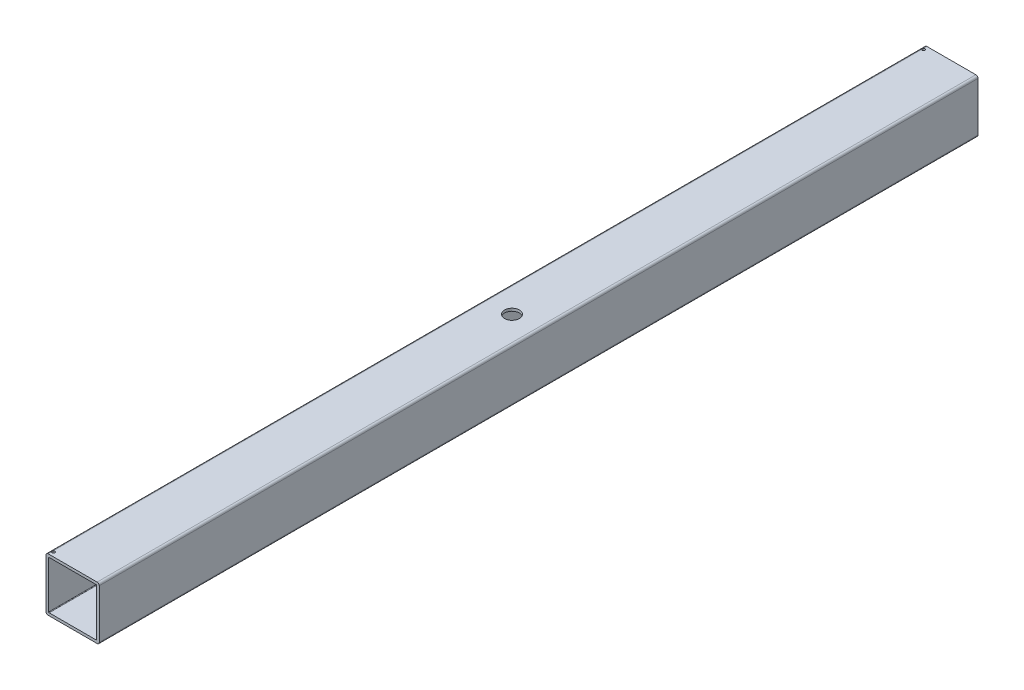
ISO-10303-21;
HEADER;
FILE_DESCRIPTION(('STEP AP214'),'2;1');
FILE_NAME('part.step','',(''),(''),'','','');
FILE_SCHEMA(('AUTOMOTIVE_DESIGN { 1 0 10303 214 1 1 1 1 }'));
ENDSEC;
DATA;
#1=APPLICATION_CONTEXT('core data for automotive mechanical design processes');
#2=APPLICATION_PROTOCOL_DEFINITION('international standard','automotive_design',2000,#1);
#3=PRODUCT_CONTEXT('',#1,'mechanical');
#4=PRODUCT('Part','Part','',(#3));
#5=PRODUCT_RELATED_PRODUCT_CATEGORY('part','',(#4));
#6=PRODUCT_DEFINITION_FORMATION('','',#4);
#7=PRODUCT_DEFINITION_CONTEXT('part definition',#1,'design');
#8=PRODUCT_DEFINITION('design','',#6,#7);
#9=PRODUCT_DEFINITION_SHAPE('','',#8);
#10=(LENGTH_UNIT() NAMED_UNIT(*) SI_UNIT(.MILLI.,.METRE.));
#11=(NAMED_UNIT(*) PLANE_ANGLE_UNIT() SI_UNIT($,.RADIAN.));
#12=(NAMED_UNIT(*) SI_UNIT($,.STERADIAN.) SOLID_ANGLE_UNIT());
#13=UNCERTAINTY_MEASURE_WITH_UNIT(LENGTH_MEASURE(1.E-05),#10,'distance_accuracy_value','');
#14=(GEOMETRIC_REPRESENTATION_CONTEXT(3) GLOBAL_UNCERTAINTY_ASSIGNED_CONTEXT((#13)) GLOBAL_UNIT_ASSIGNED_CONTEXT((#10,
#11,#12)) REPRESENTATION_CONTEXT('',''));
#15=CARTESIAN_POINT('',(0.,0.,0.));
#16=DIRECTION('',(0.,0.,1.));
#17=DIRECTION('',(1.,0.,0.));
#18=AXIS2_PLACEMENT_3D('',#15,#16,#17);
#19=CARTESIAN_POINT('',(-1271.,96.,925.));
#20=DIRECTION('',(0.,0.,-1.));
#21=DIRECTION('',(-1.,0.,0.));
#22=AXIS2_PLACEMENT_3D('',#19,#20,#21);
#23=CYLINDRICAL_SURFACE('',#22,4.);
#24=DIRECTION('',(0.,0.,1.));
#25=VECTOR('',#24,1.);
#26=CARTESIAN_POINT('',(-1271.,100.,825.));
#27=LINE('',#26,#25);
#28=CARTESIAN_POINT('',(-1271.,100.,-815.338675227417));
#29=VERTEX_POINT('',#28);
#30=CARTESIAN_POINT('',(-1271.,100.,815.338675227417));
#31=VERTEX_POINT('',#30);
#32=EDGE_CURVE('E327',#29,#31,#27,.T.);
#33=ORIENTED_EDGE('',*,*,#32,.F.);
#34=CARTESIAN_POINT('',(-1271.,100.,-815.338675227417));
#35=CARTESIAN_POINT('',(-1271.04662499454,99.9999972262744,-815.394804937775));
#36=CARTESIAN_POINT('',(-1271.09085769348,99.9991854036839,-815.452865081695));
#37=CARTESIAN_POINT('',(-1271.17427283019,99.9964200024779,-815.572464917357));
#38=CARTESIAN_POINT('',(-1271.21345628017,99.9944666531353,-815.634003908139));
#39=CARTESIAN_POINT('',(-1271.32297788215,99.9876131176814,-815.823158705195));
#40=CARTESIAN_POINT('',(-1271.38539465559,99.9817172672431,-815.955441893645));
#41=CARTESIAN_POINT('',(-1271.48719961571,99.9705515438897,-816.228566620421));
#42=CARTESIAN_POINT('',(-1271.5265839814,99.9652817749547,-816.369409574507));
#43=CARTESIAN_POINT('',(-1271.5812168886,99.9576455388125,-816.655721048284));
#44=CARTESIAN_POINT('',(-1271.59648021106,99.9552772938029,-816.801186679483));
#45=CARTESIAN_POINT('',(-1271.60242875833,99.9543761293477,-817.092297570301));
#46=CARTESIAN_POINT('',(-1271.59316930317,99.9558345773368,-817.237941686048));
#47=CARTESIAN_POINT('',(-1271.5504527553,99.9620015264689,-817.525702293928));
#48=CARTESIAN_POINT('',(-1271.51697314742,99.966713051501,-817.667815376361));
#49=CARTESIAN_POINT('',(-1271.42685399839,99.977416249734,-817.944193657739));
#50=CARTESIAN_POINT('',(-1271.37024586477,99.9834061816658,-818.078469218201));
#51=CARTESIAN_POINT('',(-1271.23547968072,99.9936294042363,-818.335509362876));
#52=CARTESIAN_POINT('',(-1271.15737691937,99.9978671328866,-818.458302411435));
#53=CARTESIAN_POINT('',(-1271.04709950854,99.9997859361939,-818.603370212158));
#54=CARTESIAN_POINT('',(-1271.02385724197,99.9999989472665,-818.632611878701));
#55=CARTESIAN_POINT('',(-1271.,100.,-818.661324772584));
#56=B_SPLINE_CURVE_WITH_KNOTS('',3,(#34,#35,#36,#37,#38,#39,#40,#41,#42,#43,#44,#45,#46,#47,#48,
#49,#50,#51,#52,#53,#54,#55),.UNSPECIFIED.,.F.,.F.,(4,2,2,2,2,2,2,2,2,2,4),(0.,0.2187556117166,
0.437467302000045,0.874392348785056,1.31138985930284,1.74811948150028,2.18386474099981,
2.62001559260322,3.05557612851083,3.49002660937734,3.60204982101434),.UNSPECIFIED.);
#57=CARTESIAN_POINT('',(-1271.,100.,-818.661324772584));
#58=VERTEX_POINT('',#57);
#59=EDGE_CURVE('E360',#29,#58,#56,.T.);
#60=ORIENTED_EDGE('',*,*,#59,.T.);
#61=CARTESIAN_POINT('',(-1271.,100.,-825.));
#62=VERTEX_POINT('',#61);
#63=EDGE_CURVE('E324',#62,#58,#27,.T.);
#64=ORIENTED_EDGE('',*,*,#63,.F.);
#65=CARTESIAN_POINT('',(-1271.,96.,-825.));
#66=DIRECTION('',(0.,0.,1.));
#67=DIRECTION('',(1.,0.,0.));
#68=AXIS2_PLACEMENT_3D('',#65,#66,#67);
#69=CIRCLE('',#68,4.);
#70=CARTESIAN_POINT('',(-1275.,96.,-825.));
#71=VERTEX_POINT('',#70);
#72=EDGE_CURVE('E342',#71,#62,#69,.F.);
#73=ORIENTED_EDGE('',*,*,#72,.F.);
#74=DIRECTION('',(0.,0.,1.));
#75=VECTOR('',#74,1.);
#76=CARTESIAN_POINT('',(-1275.,96.,-825.));
#77=LINE('',#76,#75);
#78=CARTESIAN_POINT('',(-1275.,96.,825.));
#79=VERTEX_POINT('',#78);
#80=EDGE_CURVE('E312',#79,#71,#77,.F.);
#81=ORIENTED_EDGE('',*,*,#80,.F.);
#82=CARTESIAN_POINT('',(-1271.,96.,825.));
#83=DIRECTION('',(0.,0.,-1.));
#84=DIRECTION('',(-1.,0.,0.));
#85=AXIS2_PLACEMENT_3D('',#82,#83,#84);
#86=CIRCLE('',#85,4.);
#87=CARTESIAN_POINT('',(-1271.,100.,825.));
#88=VERTEX_POINT('',#87);
#89=EDGE_CURVE('E321',#88,#79,#86,.F.);
#90=ORIENTED_EDGE('',*,*,#89,.F.);
#91=CARTESIAN_POINT('',(-1271.,100.,818.661324772584));
#92=VERTEX_POINT('',#91);
#93=EDGE_CURVE('E328',#92,#88,#27,.T.);
#94=ORIENTED_EDGE('',*,*,#93,.F.);
#95=CARTESIAN_POINT('',(-1271.,100.,818.661324772584));
#96=CARTESIAN_POINT('',(-1271.04662499454,99.9999972262744,818.605195062226));
#97=CARTESIAN_POINT('',(-1271.09085769348,99.9991854036839,818.547134918306));
#98=CARTESIAN_POINT('',(-1271.17427283019,99.9964200024779,818.427535082644));
#99=CARTESIAN_POINT('',(-1271.21345628017,99.9944666531353,818.365996091862));
#100=CARTESIAN_POINT('',(-1271.32297788215,99.9876131176814,818.176841294805));
#101=CARTESIAN_POINT('',(-1271.38539465559,99.9817172672431,818.044558106356));
#102=CARTESIAN_POINT('',(-1271.48719961571,99.9705515438897,817.771433379579));
#103=CARTESIAN_POINT('',(-1271.5265839814,99.9652817749547,817.630590425494));
#104=CARTESIAN_POINT('',(-1271.5812168886,99.9576455388125,817.344278951716));
#105=CARTESIAN_POINT('',(-1271.59648021106,99.9552772938029,817.198813320518));
#106=CARTESIAN_POINT('',(-1271.60242875833,99.9543761293477,816.907702429699));
#107=CARTESIAN_POINT('',(-1271.59316930317,99.9558345773368,816.762058313953));
#108=CARTESIAN_POINT('',(-1271.5504527553,99.9620015264689,816.474297706073));
#109=CARTESIAN_POINT('',(-1271.51697314742,99.966713051501,816.332184623639));
#110=CARTESIAN_POINT('',(-1271.42685399839,99.977416249734,816.055806342261));
#111=CARTESIAN_POINT('',(-1271.37024586477,99.9834061816658,815.9215307818));
#112=CARTESIAN_POINT('',(-1271.23547968072,99.9936294042363,815.664490637124));
#113=CARTESIAN_POINT('',(-1271.15737691937,99.9978671328866,815.541697588566));
#114=CARTESIAN_POINT('',(-1271.04709950854,99.9997859361939,815.396629787842));
#115=CARTESIAN_POINT('',(-1271.02385724197,99.9999989472665,815.3673881213));
#116=CARTESIAN_POINT('',(-1271.,100.,815.338675227417));
#117=B_SPLINE_CURVE_WITH_KNOTS('',3,(#95,#96,#97,#98,#99,#100,#101,#102,#103,#104,#105,#106,
#107,#108,#109,#110,#111,#112,#113,#114,#115,#116),.UNSPECIFIED.,.F.,.F.,(4,2,2,2,2,2,2,2,2,2,
4),(0.,0.2187556117166,0.437467302000045,0.874392348785056,1.31138985930317,1.74811948150027,
2.1838647409998,2.62001559260321,3.05557612851082,3.49002660937733,3.60204982101433),.UNSPECIFIED.);
#118=EDGE_CURVE('E361',#92,#31,#117,.T.);
#119=ORIENTED_EDGE('',*,*,#118,.T.);
#120=EDGE_LOOP('',(#33,#60,#64,#73,#81,#90,#94,#119));
#121=FACE_BOUND('',#120,.T.);
#122=ADVANCED_FACE('F19',(#121),#23,.T.);
#123=CARTESIAN_POINT('',(-1175.,100.,825.));
#124=DIRECTION('',(1.,0.,0.));
#125=DIRECTION('',(0.,0.,-1.));
#126=AXIS2_PLACEMENT_3D('',#123,#124,#125);
#127=PLANE('',#126);
#128=DIRECTION('',(0.,1.,0.));
#129=VECTOR('',#128,1.);
#130=CARTESIAN_POINT('',(-1175.,100.,825.));
#131=LINE('',#130,#129);
#132=CARTESIAN_POINT('',(-1175.,4.,825.));
#133=VERTEX_POINT('',#132);
#134=CARTESIAN_POINT('',(-1175.,96.,825.));
#135=VERTEX_POINT('',#134);
#136=EDGE_CURVE('E264',#133,#135,#131,.T.);
#137=ORIENTED_EDGE('',*,*,#136,.F.);
#138=DIRECTION('',(0.,0.,1.));
#139=VECTOR('',#138,1.);
#140=CARTESIAN_POINT('',(-1175.,4.,825.));
#141=LINE('',#140,#139);
#142=CARTESIAN_POINT('',(-1175.,4.,-825.));
#143=VERTEX_POINT('',#142);
#144=EDGE_CURVE('E340',#133,#143,#141,.F.);
#145=ORIENTED_EDGE('',*,*,#144,.T.);
#146=DIRECTION('',(0.,1.,0.));
#147=VECTOR('',#146,1.);
#148=CARTESIAN_POINT('',(-1175.,100.,-825.));
#149=LINE('',#148,#147);
#150=CARTESIAN_POINT('',(-1175.,96.,-825.));
#151=VERTEX_POINT('',#150);
#152=EDGE_CURVE('E260',#151,#143,#149,.F.);
#153=ORIENTED_EDGE('',*,*,#152,.F.);
#154=DIRECTION('',(0.,0.,1.));
#155=VECTOR('',#154,1.);
#156=CARTESIAN_POINT('',(-1175.,96.,825.));
#157=LINE('',#156,#155);
#158=EDGE_CURVE('E337',#151,#135,#157,.T.);
#159=ORIENTED_EDGE('',*,*,#158,.T.);
#160=EDGE_LOOP('',(#137,#145,#153,#159));
#161=FACE_BOUND('',#160,.T.);
#162=ADVANCED_FACE('F403',(#161),#127,.T.);
#163=CARTESIAN_POINT('',(358.3,100.,925.));
#164=DIRECTION('',(0.,1.,0.));
#165=DIRECTION('',(0.,0.,1.));
#166=AXIS2_PLACEMENT_3D('',#163,#164,#165);
#167=PLANE('',#166);
#168=CARTESIAN_POINT('',(-1225.,100.,1.500192328956E-13));
#169=DIRECTION('',(0.,1.,0.));
#170=DIRECTION('',(0.,0.,1.));
#171=AXIS2_PLACEMENT_3D('',#168,#169,#170);
#172=CIRCLE('',#171,14.0000000000001);
#173=CARTESIAN_POINT('',(-1225.,100.,14.0000000000002));
#174=VERTEX_POINT('',#173);
#175=EDGE_CURVE('E235',#174,#174,#172,.T.);
#176=ORIENTED_EDGE('',*,*,#175,.F.);
#177=EDGE_LOOP('',(#176));
#178=FACE_BOUND('',#177,.T.);
#179=ORIENTED_EDGE('',*,*,#63,.T.);
#180=CARTESIAN_POINT('',(-1269.,100.,-817.));
#181=DIRECTION('',(0.,1.,0.));
#182=DIRECTION('',(0.,0.,1.));
#183=AXIS2_PLACEMENT_3D('',#180,#181,#182);
#184=CIRCLE('',#183,2.59999999999994);
#185=EDGE_CURVE('E42',#58,#29,#184,.F.);
#186=ORIENTED_EDGE('',*,*,#185,.T.);
#187=ORIENTED_EDGE('',*,*,#32,.T.);
#188=CARTESIAN_POINT('',(-1269.,100.,817.));
#189=DIRECTION('',(0.,1.,0.));
#190=DIRECTION('',(0.,0.,1.));
#191=AXIS2_PLACEMENT_3D('',#188,#189,#190);
#192=CIRCLE('',#191,2.59999999999994);
#193=EDGE_CURVE('E35',#31,#92,#192,.F.);
#194=ORIENTED_EDGE('',*,*,#193,.T.);
#195=ORIENTED_EDGE('',*,*,#93,.T.);
#196=DIRECTION('',(1.,0.,0.));
#197=VECTOR('',#196,1.);
#198=CARTESIAN_POINT('',(0.,100.,825.));
#199=LINE('',#198,#197);
#200=CARTESIAN_POINT('',(-1179.,100.,825.));
#201=VERTEX_POINT('',#200);
#202=EDGE_CURVE('E268',#201,#88,#199,.F.);
#203=ORIENTED_EDGE('',*,*,#202,.F.);
#204=DIRECTION('',(0.,0.,1.));
#205=VECTOR('',#204,1.);
#206=CARTESIAN_POINT('',(-1179.,100.,925.));
#207=LINE('',#206,#205);
#208=CARTESIAN_POINT('',(-1179.,100.,-825.));
#209=VERTEX_POINT('',#208);
#210=EDGE_CURVE('E323',#201,#209,#207,.F.);
#211=ORIENTED_EDGE('',*,*,#210,.T.);
#212=DIRECTION('',(-1.,0.,0.));
#213=VECTOR('',#212,1.);
#214=CARTESIAN_POINT('',(-1175.,100.,-825.));
#215=LINE('',#214,#213);
#216=EDGE_CURVE('E255',#209,#62,#215,.T.);
#217=ORIENTED_EDGE('',*,*,#216,.T.);
#218=EDGE_LOOP('',(#179,#186,#187,#194,#195,#203,#211,#217));
#219=FACE_BOUND('',#218,.T.);
#220=ADVANCED_FACE('F358',(#178,#219),#167,.T.);
#221=CARTESIAN_POINT('',(-1275.,100.,825.));
#222=DIRECTION('',(0.,0.,-1.));
#223=DIRECTION('',(-1.,0.,0.));
#224=AXIS2_PLACEMENT_3D('',#221,#222,#223);
#225=PLANE('',#224);
#226=DIRECTION('',(0.,1.,0.));
#227=VECTOR('',#226,1.);
#228=CARTESIAN_POINT('',(-1270.,100.,825.));
#229=LINE('',#228,#227);
#230=CARTESIAN_POINT('',(-1270.,5.99999999999977,825.));
#231=VERTEX_POINT('',#230);
#232=CARTESIAN_POINT('',(-1270.,93.9999999999998,825.));
#233=VERTEX_POINT('',#232);
#234=EDGE_CURVE('E241',#231,#233,#229,.T.);
#235=ORIENTED_EDGE('',*,*,#234,.T.);
#236=CARTESIAN_POINT('',(-1269.,93.9999999999998,825.));
#237=DIRECTION('',(0.,0.,-1.));
#238=DIRECTION('',(-1.,0.,0.));
#239=AXIS2_PLACEMENT_3D('',#236,#237,#238);
#240=CIRCLE('',#239,1.);
#241=CARTESIAN_POINT('',(-1269.,94.9999999999998,825.));
#242=VERTEX_POINT('',#241);
#243=EDGE_CURVE('E12',#233,#242,#240,.T.);
#244=ORIENTED_EDGE('',*,*,#243,.T.);
#245=DIRECTION('',(1.,0.,0.));
#246=VECTOR('',#245,1.);
#247=CARTESIAN_POINT('',(-1275.,94.9999999999998,825.));
#248=LINE('',#247,#246);
#249=CARTESIAN_POINT('',(-1181.,94.9999999999998,825.));
#250=VERTEX_POINT('',#249);
#251=EDGE_CURVE('E245',#242,#250,#248,.T.);
#252=ORIENTED_EDGE('',*,*,#251,.T.);
#253=CARTESIAN_POINT('',(-1181.,93.9999999999998,825.));
#254=DIRECTION('',(0.,0.,-1.));
#255=DIRECTION('',(-1.,0.,0.));
#256=AXIS2_PLACEMENT_3D('',#253,#254,#255);
#257=CIRCLE('',#256,1.);
#258=CARTESIAN_POINT('',(-1180.,93.9999999999998,825.));
#259=VERTEX_POINT('',#258);
#260=EDGE_CURVE('E608',#250,#259,#257,.T.);
#261=ORIENTED_EDGE('',*,*,#260,.T.);
#262=DIRECTION('',(0.,-1.,0.));
#263=VECTOR('',#262,1.);
#264=CARTESIAN_POINT('',(-1180.,100.,825.));
#265=LINE('',#264,#263);
#266=CARTESIAN_POINT('',(-1180.,5.99999999999977,825.));
#267=VERTEX_POINT('',#266);
#268=EDGE_CURVE('E248',#259,#267,#265,.T.);
#269=ORIENTED_EDGE('',*,*,#268,.T.);
#270=CARTESIAN_POINT('',(-1181.,5.99999999999977,825.));
#271=DIRECTION('',(0.,0.,-1.));
#272=DIRECTION('',(-1.,0.,0.));
#273=AXIS2_PLACEMENT_3D('',#270,#271,#272);
#274=CIRCLE('',#273,1.);
#275=CARTESIAN_POINT('',(-1181.,4.99999999999977,825.));
#276=VERTEX_POINT('',#275);
#277=EDGE_CURVE('E606',#267,#276,#274,.T.);
#278=ORIENTED_EDGE('',*,*,#277,.T.);
#279=DIRECTION('',(-1.,0.,0.));
#280=VECTOR('',#279,1.);
#281=CARTESIAN_POINT('',(-1275.,4.99999999999977,825.));
#282=LINE('',#281,#280);
#283=CARTESIAN_POINT('',(-1269.,4.99999999999977,825.));
#284=VERTEX_POINT('',#283);
#285=EDGE_CURVE('E239',#276,#284,#282,.T.);
#286=ORIENTED_EDGE('',*,*,#285,.T.);
#287=CARTESIAN_POINT('',(-1269.,5.99999999999977,825.));
#288=DIRECTION('',(0.,0.,-1.));
#289=DIRECTION('',(-1.,0.,0.));
#290=AXIS2_PLACEMENT_3D('',#287,#288,#289);
#291=CIRCLE('',#290,1.);
#292=EDGE_CURVE('E300',#284,#231,#291,.T.);
#293=ORIENTED_EDGE('',*,*,#292,.T.);
#294=EDGE_LOOP('',(#235,#244,#252,#261,#269,#278,#286,#293));
#295=FACE_BOUND('',#294,.T.);
#296=DIRECTION('',(1.,0.,0.));
#297=VECTOR('',#296,1.);
#298=CARTESIAN_POINT('',(0.,0.,825.));
#299=LINE('',#298,#297);
#300=CARTESIAN_POINT('',(-1271.,0.,825.));
#301=VERTEX_POINT('',#300);
#302=CARTESIAN_POINT('',(-1179.,0.,825.));
#303=VERTEX_POINT('',#302);
#304=EDGE_CURVE('E251',#301,#303,#299,.T.);
#305=ORIENTED_EDGE('',*,*,#304,.T.);
#306=CARTESIAN_POINT('',(-1179.,4.,825.));
#307=DIRECTION('',(0.,0.,-1.));
#308=DIRECTION('',(-1.,0.,0.));
#309=AXIS2_PLACEMENT_3D('',#306,#307,#308);
#310=CIRCLE('',#309,4.);
#311=EDGE_CURVE('E314',#303,#133,#310,.F.);
#312=ORIENTED_EDGE('',*,*,#311,.T.);
#313=ORIENTED_EDGE('',*,*,#136,.T.);
#314=CARTESIAN_POINT('',(-1179.,96.,825.));
#315=DIRECTION('',(0.,0.,-1.));
#316=DIRECTION('',(-1.,0.,0.));
#317=AXIS2_PLACEMENT_3D('',#314,#315,#316);
#318=CIRCLE('',#317,4.);
#319=EDGE_CURVE('E319',#135,#201,#318,.F.);
#320=ORIENTED_EDGE('',*,*,#319,.T.);
#321=ORIENTED_EDGE('',*,*,#202,.T.);
#322=ORIENTED_EDGE('',*,*,#89,.T.);
#323=DIRECTION('',(0.,1.,0.));
#324=VECTOR('',#323,1.);
#325=CARTESIAN_POINT('',(-1275.,500.,825.));
#326=LINE('',#325,#324);
#327=CARTESIAN_POINT('',(-1275.,4.,825.));
#328=VERTEX_POINT('',#327);
#329=EDGE_CURVE('E252',#328,#79,#326,.T.);
#330=ORIENTED_EDGE('',*,*,#329,.F.);
#331=CARTESIAN_POINT('',(-1271.,4.,825.));
#332=DIRECTION('',(0.,0.,-1.));
#333=DIRECTION('',(-1.,0.,0.));
#334=AXIS2_PLACEMENT_3D('',#331,#332,#333);
#335=CIRCLE('',#334,4.);
#336=EDGE_CURVE('E317',#328,#301,#335,.F.);
#337=ORIENTED_EDGE('',*,*,#336,.T.);
#338=EDGE_LOOP('',(#305,#312,#313,#320,#321,#322,#330,#337));
#339=FACE_BOUND('',#338,.T.);
#340=ADVANCED_FACE('F407',(#295,#339),#225,.F.);
#341=CARTESIAN_POINT('',(0.,0.,0.));
#342=DIRECTION('',(0.,-1.,0.));
#343=DIRECTION('',(0.,0.,-1.));
#344=AXIS2_PLACEMENT_3D('',#341,#342,#343);
#345=PLANE('',#344);
#346=CARTESIAN_POINT('',(-1225.,0.,1.500192328956E-13));
#347=DIRECTION('',(0.,-1.,0.));
#348=DIRECTION('',(0.,0.,-1.));
#349=AXIS2_PLACEMENT_3D('',#346,#347,#348);
#350=CIRCLE('',#349,14.0000000000001);
#351=CARTESIAN_POINT('',(-1225.,0.,-13.9999999999999));
#352=VERTEX_POINT('',#351);
#353=EDGE_CURVE('E227',#352,#352,#350,.T.);
#354=ORIENTED_EDGE('',*,*,#353,.F.);
#355=EDGE_LOOP('',(#354));
#356=FACE_BOUND('',#355,.T.);
#357=DIRECTION('',(-1.,0.,0.));
#358=VECTOR('',#357,1.);
#359=CARTESIAN_POINT('',(0.,0.,-825.));
#360=LINE('',#359,#358);
#361=CARTESIAN_POINT('',(-1179.,0.,-825.));
#362=VERTEX_POINT('',#361);
#363=CARTESIAN_POINT('',(-1271.,0.,-825.));
#364=VERTEX_POINT('',#363);
#365=EDGE_CURVE('E261',#362,#364,#360,.T.);
#366=ORIENTED_EDGE('',*,*,#365,.F.);
#367=DIRECTION('',(0.,0.,1.));
#368=VECTOR('',#367,1.);
#369=CARTESIAN_POINT('',(-1179.,0.,0.));
#370=LINE('',#369,#368);
#371=EDGE_CURVE('E335',#362,#303,#370,.T.);
#372=ORIENTED_EDGE('',*,*,#371,.T.);
#373=ORIENTED_EDGE('',*,*,#304,.F.);
#374=DIRECTION('',(0.,0.,-1.));
#375=VECTOR('',#374,1.);
#376=CARTESIAN_POINT('',(-1271.,0.,-825.));
#377=LINE('',#376,#375);
#378=EDGE_CURVE('E215',#301,#364,#377,.T.);
#379=ORIENTED_EDGE('',*,*,#378,.T.);
#380=EDGE_LOOP('',(#366,#372,#373,#379));
#381=FACE_BOUND('',#380,.T.);
#382=ADVANCED_FACE('F413',(#356,#381),#345,.T.);
#383=CARTESIAN_POINT('',(-1175.,100.,-825.));
#384=DIRECTION('',(0.,0.,1.));
#385=DIRECTION('',(1.,0.,0.));
#386=AXIS2_PLACEMENT_3D('',#383,#384,#385);
#387=PLANE('',#386);
#388=DIRECTION('',(0.,-1.,0.));
#389=VECTOR('',#388,1.);
#390=CARTESIAN_POINT('',(-1270.,100.,-825.));
#391=LINE('',#390,#389);
#392=CARTESIAN_POINT('',(-1270.,94.,-825.));
#393=VERTEX_POINT('',#392);
#394=CARTESIAN_POINT('',(-1270.,6.00000000000001,-825.));
#395=VERTEX_POINT('',#394);
#396=EDGE_CURVE('E201',#393,#395,#391,.T.);
#397=ORIENTED_EDGE('',*,*,#396,.T.);
#398=CARTESIAN_POINT('',(-1269.,6.,-825.));
#399=DIRECTION('',(0.,0.,1.));
#400=DIRECTION('',(1.,0.,0.));
#401=AXIS2_PLACEMENT_3D('',#398,#399,#400);
#402=CIRCLE('',#401,1.);
#403=CARTESIAN_POINT('',(-1269.,4.99999999999999,-825.));
#404=VERTEX_POINT('',#403);
#405=EDGE_CURVE('E286',#395,#404,#402,.T.);
#406=ORIENTED_EDGE('',*,*,#405,.T.);
#407=DIRECTION('',(1.,0.,0.));
#408=VECTOR('',#407,1.);
#409=CARTESIAN_POINT('',(-1175.,4.99999999999999,-825.));
#410=LINE('',#409,#408);
#411=CARTESIAN_POINT('',(-1181.,4.99999999999999,-825.));
#412=VERTEX_POINT('',#411);
#413=EDGE_CURVE('E207',#404,#412,#410,.T.);
#414=ORIENTED_EDGE('',*,*,#413,.T.);
#415=CARTESIAN_POINT('',(-1181.,6.,-825.));
#416=DIRECTION('',(0.,0.,1.));
#417=DIRECTION('',(1.,0.,0.));
#418=AXIS2_PLACEMENT_3D('',#415,#416,#417);
#419=CIRCLE('',#418,1.);
#420=CARTESIAN_POINT('',(-1180.,6.00000000000001,-825.));
#421=VERTEX_POINT('',#420);
#422=EDGE_CURVE('E284',#412,#421,#419,.T.);
#423=ORIENTED_EDGE('',*,*,#422,.T.);
#424=DIRECTION('',(0.,1.,0.));
#425=VECTOR('',#424,1.);
#426=CARTESIAN_POINT('',(-1180.,100.,-825.));
#427=LINE('',#426,#425);
#428=CARTESIAN_POINT('',(-1180.,94.,-825.));
#429=VERTEX_POINT('',#428);
#430=EDGE_CURVE('E211',#421,#429,#427,.T.);
#431=ORIENTED_EDGE('',*,*,#430,.T.);
#432=CARTESIAN_POINT('',(-1181.,94.,-825.));
#433=DIRECTION('',(0.,0.,1.));
#434=DIRECTION('',(1.,0.,0.));
#435=AXIS2_PLACEMENT_3D('',#432,#433,#434);
#436=CIRCLE('',#435,1.);
#437=CARTESIAN_POINT('',(-1181.,95.,-825.));
#438=VERTEX_POINT('',#437);
#439=EDGE_CURVE('E609',#429,#438,#436,.T.);
#440=ORIENTED_EDGE('',*,*,#439,.T.);
#441=DIRECTION('',(-1.,0.,0.));
#442=VECTOR('',#441,1.);
#443=CARTESIAN_POINT('',(-1175.,95.,-825.));
#444=LINE('',#443,#442);
#445=CARTESIAN_POINT('',(-1269.,95.,-825.));
#446=VERTEX_POINT('',#445);
#447=EDGE_CURVE('E206',#438,#446,#444,.T.);
#448=ORIENTED_EDGE('',*,*,#447,.T.);
#449=CARTESIAN_POINT('',(-1269.,94.,-825.));
#450=DIRECTION('',(0.,0.,1.));
#451=DIRECTION('',(1.,0.,0.));
#452=AXIS2_PLACEMENT_3D('',#449,#450,#451);
#453=CIRCLE('',#452,1.);
#454=EDGE_CURVE('E29',#446,#393,#453,.T.);
#455=ORIENTED_EDGE('',*,*,#454,.T.);
#456=EDGE_LOOP('',(#397,#406,#414,#423,#431,#440,#448,#455));
#457=FACE_BOUND('',#456,.T.);
#458=ORIENTED_EDGE('',*,*,#152,.T.);
#459=CARTESIAN_POINT('',(-1179.,4.,-825.));
#460=DIRECTION('',(0.,0.,1.));
#461=DIRECTION('',(1.,0.,0.));
#462=AXIS2_PLACEMENT_3D('',#459,#460,#461);
#463=CIRCLE('',#462,4.);
#464=EDGE_CURVE('E329',#143,#362,#463,.F.);
#465=ORIENTED_EDGE('',*,*,#464,.T.);
#466=ORIENTED_EDGE('',*,*,#365,.T.);
#467=CARTESIAN_POINT('',(-1271.,4.,-825.));
#468=DIRECTION('',(0.,0.,1.));
#469=DIRECTION('',(1.,0.,0.));
#470=AXIS2_PLACEMENT_3D('',#467,#468,#469);
#471=CIRCLE('',#470,4.);
#472=CARTESIAN_POINT('',(-1275.,4.,-825.));
#473=VERTEX_POINT('',#472);
#474=EDGE_CURVE('E344',#364,#473,#471,.F.);
#475=ORIENTED_EDGE('',*,*,#474,.T.);
#476=DIRECTION('',(0.,-1.,0.));
#477=VECTOR('',#476,1.);
#478=CARTESIAN_POINT('',(-1275.,500.,-825.));
#479=LINE('',#478,#477);
#480=EDGE_CURVE('E256',#71,#473,#479,.T.);
#481=ORIENTED_EDGE('',*,*,#480,.F.);
#482=ORIENTED_EDGE('',*,*,#72,.T.);
#483=ORIENTED_EDGE('',*,*,#216,.F.);
#484=CARTESIAN_POINT('',(-1179.,96.,-825.));
#485=DIRECTION('',(0.,0.,1.));
#486=DIRECTION('',(1.,0.,0.));
#487=AXIS2_PLACEMENT_3D('',#484,#485,#486);
#488=CIRCLE('',#487,4.);
#489=EDGE_CURVE('E345',#209,#151,#488,.F.);
#490=ORIENTED_EDGE('',*,*,#489,.T.);
#491=EDGE_LOOP('',(#458,#465,#466,#475,#481,#482,#483,#490));
#492=FACE_BOUND('',#491,.T.);
#493=ADVANCED_FACE('F282',(#457,#492),#387,.F.);
#494=CARTESIAN_POINT('',(-1275.,500.,0.));
#495=DIRECTION('',(1.,0.,0.));
#496=DIRECTION('',(0.,0.,-1.));
#497=AXIS2_PLACEMENT_3D('',#494,#495,#496);
#498=PLANE('',#497);
#499=ORIENTED_EDGE('',*,*,#480,.T.);
#500=DIRECTION('',(0.,0.,-1.));
#501=VECTOR('',#500,1.);
#502=CARTESIAN_POINT('',(-1275.,4.,825.));
#503=LINE('',#502,#501);
#504=EDGE_CURVE('E310',#473,#328,#503,.F.);
#505=ORIENTED_EDGE('',*,*,#504,.T.);
#506=ORIENTED_EDGE('',*,*,#329,.T.);
#507=ORIENTED_EDGE('',*,*,#80,.T.);
#508=EDGE_LOOP('',(#499,#505,#506,#507));
#509=FACE_BOUND('',#508,.T.);
#510=ADVANCED_FACE('F398',(#509),#498,.F.);
#511=CARTESIAN_POINT('',(-1180.,94.9999999999997,925.));
#512=DIRECTION('',(1.,0.,0.));
#513=DIRECTION('',(0.,0.,-1.));
#514=AXIS2_PLACEMENT_3D('',#511,#512,#513);
#515=PLANE('',#514);
#516=ORIENTED_EDGE('',*,*,#430,.F.);
#517=DIRECTION('',(0.,0.,-1.));
#518=VECTOR('',#517,1.);
#519=CARTESIAN_POINT('',(-1180.,5.99999999999977,825.));
#520=LINE('',#519,#518);
#521=EDGE_CURVE('E189',#421,#267,#520,.F.);
#522=ORIENTED_EDGE('',*,*,#521,.T.);
#523=ORIENTED_EDGE('',*,*,#268,.F.);
#524=DIRECTION('',(0.,0.,-1.));
#525=VECTOR('',#524,1.);
#526=CARTESIAN_POINT('',(-1180.,94.,-825.));
#527=LINE('',#526,#525);
#528=EDGE_CURVE('E301',#259,#429,#527,.T.);
#529=ORIENTED_EDGE('',*,*,#528,.T.);
#530=EDGE_LOOP('',(#516,#522,#523,#529));
#531=FACE_BOUND('',#530,.T.);
#532=ADVANCED_FACE('F388',(#531),#515,.F.);
#533=CARTESIAN_POINT('',(-1270.,94.9999999999997,925.));
#534=DIRECTION('',(0.,1.,0.));
#535=DIRECTION('',(0.,0.,1.));
#536=AXIS2_PLACEMENT_3D('',#533,#534,#535);
#537=PLANE('',#536);
#538=CARTESIAN_POINT('',(-1269.,95.,-817.));
#539=DIRECTION('',(0.,1.,0.));
#540=DIRECTION('',(0.,0.,1.));
#541=AXIS2_PLACEMENT_3D('',#538,#539,#540);
#542=CIRCLE('',#541,2.59999999999994);
#543=CARTESIAN_POINT('',(-1269.,95.,-814.4));
#544=VERTEX_POINT('',#543);
#545=CARTESIAN_POINT('',(-1269.,95.,-819.6));
#546=VERTEX_POINT('',#545);
#547=EDGE_CURVE('E362',#544,#546,#542,.T.);
#548=ORIENTED_EDGE('',*,*,#547,.T.);
#549=DIRECTION('',(0.,0.,-1.));
#550=VECTOR('',#549,1.);
#551=CARTESIAN_POINT('',(-1269.,95.,-825.));
#552=LINE('',#551,#550);
#553=EDGE_CURVE('E184',#546,#446,#552,.T.);
#554=ORIENTED_EDGE('',*,*,#553,.T.);
#555=ORIENTED_EDGE('',*,*,#447,.F.);
#556=DIRECTION('',(0.,0.,-1.));
#557=VECTOR('',#556,1.);
#558=CARTESIAN_POINT('',(-1181.,94.9999999999998,825.));
#559=LINE('',#558,#557);
#560=EDGE_CURVE('E188',#438,#250,#559,.F.);
#561=ORIENTED_EDGE('',*,*,#560,.T.);
#562=ORIENTED_EDGE('',*,*,#251,.F.);
#563=CARTESIAN_POINT('',(-1269.,94.9999999999998,819.6));
#564=VERTEX_POINT('',#563);
#565=EDGE_CURVE('E165',#242,#564,#552,.T.);
#566=ORIENTED_EDGE('',*,*,#565,.T.);
#567=CARTESIAN_POINT('',(-1269.,95.,817.));
#568=DIRECTION('',(0.,1.,0.));
#569=DIRECTION('',(0.,0.,-1.));
#570=AXIS2_PLACEMENT_3D('',#567,#568,#569);
#571=CIRCLE('',#570,2.59999999999994);
#572=CARTESIAN_POINT('',(-1269.,95.,814.4));
#573=VERTEX_POINT('',#572);
#574=EDGE_CURVE('E171',#564,#573,#571,.T.);
#575=ORIENTED_EDGE('',*,*,#574,.T.);
#576=EDGE_CURVE('E166',#573,#544,#552,.T.);
#577=ORIENTED_EDGE('',*,*,#576,.T.);
#578=EDGE_LOOP('',(#548,#554,#555,#561,#562,#566,#575,#577));
#579=FACE_BOUND('',#578,.T.);
#580=CARTESIAN_POINT('',(-1225.,94.9999999999999,1.500192328956E-13));
#581=DIRECTION('',(0.,1.,0.));
#582=DIRECTION('',(0.,0.,1.));
#583=AXIS2_PLACEMENT_3D('',#580,#581,#582);
#584=CIRCLE('',#583,14.0000000000001);
#585=CARTESIAN_POINT('',(-1225.,94.9999999999999,14.0000000000002));
#586=VERTEX_POINT('',#585);
#587=EDGE_CURVE('E233',#586,#586,#584,.T.);
#588=ORIENTED_EDGE('',*,*,#587,.T.);
#589=EDGE_LOOP('',(#588));
#590=FACE_BOUND('',#589,.T.);
#591=ADVANCED_FACE('F177',(#579,#590),#537,.F.);
#592=CARTESIAN_POINT('',(-1270.,4.99999999999976,925.));
#593=DIRECTION('',(-1.,0.,0.));
#594=DIRECTION('',(0.,0.,1.));
#595=AXIS2_PLACEMENT_3D('',#592,#593,#594);
#596=PLANE('',#595);
#597=ORIENTED_EDGE('',*,*,#234,.F.);
#598=DIRECTION('',(0.,0.,-1.));
#599=VECTOR('',#598,1.);
#600=CARTESIAN_POINT('',(-1270.,6.,-825.));
#601=LINE('',#600,#599);
#602=EDGE_CURVE('E304',#231,#395,#601,.T.);
#603=ORIENTED_EDGE('',*,*,#602,.T.);
#604=ORIENTED_EDGE('',*,*,#396,.F.);
#605=DIRECTION('',(0.,0.,-1.));
#606=VECTOR('',#605,1.);
#607=CARTESIAN_POINT('',(-1270.,93.9999999999998,825.));
#608=LINE('',#607,#606);
#609=EDGE_CURVE('E308',#393,#233,#608,.F.);
#610=ORIENTED_EDGE('',*,*,#609,.T.);
#611=EDGE_LOOP('',(#597,#603,#604,#610));
#612=FACE_BOUND('',#611,.T.);
#613=ADVANCED_FACE('F387',(#612),#596,.F.);
#614=CARTESIAN_POINT('',(-1180.,4.99999999999976,925.));
#615=DIRECTION('',(0.,-1.,0.));
#616=DIRECTION('',(0.,0.,-1.));
#617=AXIS2_PLACEMENT_3D('',#614,#615,#616);
#618=PLANE('',#617);
#619=CARTESIAN_POINT('',(-1225.,4.99999999999989,1.500192328956E-13));
#620=DIRECTION('',(0.,-1.,0.));
#621=DIRECTION('',(0.,0.,-1.));
#622=AXIS2_PLACEMENT_3D('',#619,#620,#621);
#623=CIRCLE('',#622,14.0000000000001);
#624=CARTESIAN_POINT('',(-1225.,4.9999999999999,-13.9999999999999));
#625=VERTEX_POINT('',#624);
#626=EDGE_CURVE('E23',#625,#625,#623,.T.);
#627=ORIENTED_EDGE('',*,*,#626,.T.);
#628=EDGE_LOOP('',(#627));
#629=FACE_BOUND('',#628,.T.);
#630=ORIENTED_EDGE('',*,*,#413,.F.);
#631=DIRECTION('',(0.,0.,-1.));
#632=VECTOR('',#631,1.);
#633=CARTESIAN_POINT('',(-1269.,4.99999999999977,825.));
#634=LINE('',#633,#632);
#635=EDGE_CURVE('E292',#404,#284,#634,.F.);
#636=ORIENTED_EDGE('',*,*,#635,.T.);
#637=ORIENTED_EDGE('',*,*,#285,.F.);
#638=DIRECTION('',(0.,0.,-1.));
#639=VECTOR('',#638,1.);
#640=CARTESIAN_POINT('',(-1181.,5.,-825.));
#641=LINE('',#640,#639);
#642=EDGE_CURVE('E294',#276,#412,#641,.T.);
#643=ORIENTED_EDGE('',*,*,#642,.T.);
#644=EDGE_LOOP('',(#630,#636,#637,#643));
#645=FACE_BOUND('',#644,.T.);
#646=ADVANCED_FACE('F290',(#629,#645),#618,.F.);
#647=CARTESIAN_POINT('',(-1179.,4.,0.));
#648=DIRECTION('',(0.,0.,1.));
#649=DIRECTION('',(1.,0.,0.));
#650=AXIS2_PLACEMENT_3D('',#647,#648,#649);
#651=CYLINDRICAL_SURFACE('',#650,4.);
#652=ORIENTED_EDGE('',*,*,#464,.F.);
#653=ORIENTED_EDGE('',*,*,#144,.F.);
#654=ORIENTED_EDGE('',*,*,#311,.F.);
#655=ORIENTED_EDGE('',*,*,#371,.F.);
#656=EDGE_LOOP('',(#652,#653,#654,#655));
#657=FACE_BOUND('',#656,.T.);
#658=ADVANCED_FACE('F394',(#657),#651,.T.);
#659=CARTESIAN_POINT('',(-1179.,96.,825.));
#660=DIRECTION('',(0.,0.,1.));
#661=DIRECTION('',(1.,0.,0.));
#662=AXIS2_PLACEMENT_3D('',#659,#660,#661);
#663=CYLINDRICAL_SURFACE('',#662,4.);
#664=ORIENTED_EDGE('',*,*,#319,.F.);
#665=ORIENTED_EDGE('',*,*,#158,.F.);
#666=ORIENTED_EDGE('',*,*,#489,.F.);
#667=ORIENTED_EDGE('',*,*,#210,.F.);
#668=EDGE_LOOP('',(#664,#665,#666,#667));
#669=FACE_BOUND('',#668,.T.);
#670=ADVANCED_FACE('F422',(#669),#663,.T.);
#671=CARTESIAN_POINT('',(-1271.,4.,0.));
#672=DIRECTION('',(0.,0.,1.));
#673=DIRECTION('',(1.,0.,0.));
#674=AXIS2_PLACEMENT_3D('',#671,#672,#673);
#675=CYLINDRICAL_SURFACE('',#674,4.);
#676=ORIENTED_EDGE('',*,*,#336,.F.);
#677=ORIENTED_EDGE('',*,*,#504,.F.);
#678=ORIENTED_EDGE('',*,*,#474,.F.);
#679=ORIENTED_EDGE('',*,*,#378,.F.);
#680=EDGE_LOOP('',(#676,#677,#678,#679));
#681=FACE_BOUND('',#680,.T.);
#682=ADVANCED_FACE('F425',(#681),#675,.T.);
#683=CARTESIAN_POINT('',(-1269.,5.99999999999976,925.));
#684=DIRECTION('',(0.,0.,1.));
#685=DIRECTION('',(0.,-1.,0.));
#686=AXIS2_PLACEMENT_3D('',#683,#684,#685);
#687=CYLINDRICAL_SURFACE('',#686,1.);
#688=ORIENTED_EDGE('',*,*,#292,.F.);
#689=ORIENTED_EDGE('',*,*,#635,.F.);
#690=ORIENTED_EDGE('',*,*,#405,.F.);
#691=ORIENTED_EDGE('',*,*,#602,.F.);
#692=EDGE_LOOP('',(#688,#689,#690,#691));
#693=FACE_BOUND('',#692,.T.);
#694=ADVANCED_FACE('F297',(#693),#687,.F.);
#695=CARTESIAN_POINT('',(-1181.,5.99999999999976,925.));
#696=DIRECTION('',(0.,0.,1.));
#697=DIRECTION('',(0.,-1.,0.));
#698=AXIS2_PLACEMENT_3D('',#695,#696,#697);
#699=CYLINDRICAL_SURFACE('',#698,1.);
#700=ORIENTED_EDGE('',*,*,#277,.F.);
#701=ORIENTED_EDGE('',*,*,#521,.F.);
#702=ORIENTED_EDGE('',*,*,#422,.F.);
#703=ORIENTED_EDGE('',*,*,#642,.F.);
#704=EDGE_LOOP('',(#700,#701,#702,#703));
#705=FACE_BOUND('',#704,.T.);
#706=ADVANCED_FACE('F433',(#705),#699,.F.);
#707=CARTESIAN_POINT('',(-1181.,93.9999999999997,925.));
#708=DIRECTION('',(0.,0.,1.));
#709=DIRECTION('',(0.,-1.,0.));
#710=AXIS2_PLACEMENT_3D('',#707,#708,#709);
#711=CYLINDRICAL_SURFACE('',#710,1.);
#712=ORIENTED_EDGE('',*,*,#260,.F.);
#713=ORIENTED_EDGE('',*,*,#560,.F.);
#714=ORIENTED_EDGE('',*,*,#439,.F.);
#715=ORIENTED_EDGE('',*,*,#528,.F.);
#716=EDGE_LOOP('',(#712,#713,#714,#715));
#717=FACE_BOUND('',#716,.T.);
#718=ADVANCED_FACE('F523',(#717),#711,.F.);
#719=CARTESIAN_POINT('',(-1269.,93.9999999999997,925.));
#720=DIRECTION('',(0.,0.,1.));
#721=DIRECTION('',(0.,-1.,0.));
#722=AXIS2_PLACEMENT_3D('',#719,#720,#721);
#723=CYLINDRICAL_SURFACE('',#722,1.);
#724=ORIENTED_EDGE('',*,*,#243,.F.);
#725=ORIENTED_EDGE('',*,*,#609,.F.);
#726=ORIENTED_EDGE('',*,*,#454,.F.);
#727=ORIENTED_EDGE('',*,*,#553,.F.);
#728=EDGE_CURVE('E183',#544,#546,#552,.T.);
#729=ORIENTED_EDGE('',*,*,#728,.F.);
#730=ORIENTED_EDGE('',*,*,#576,.F.);
#731=EDGE_CURVE('E156',#564,#573,#552,.T.);
#732=ORIENTED_EDGE('',*,*,#731,.F.);
#733=ORIENTED_EDGE('',*,*,#565,.F.);
#734=EDGE_LOOP('',(#724,#725,#726,#727,#729,#730,#732,#733));
#735=FACE_BOUND('',#734,.T.);
#736=ADVANCED_FACE('F21',(#735),#723,.F.);
#737=CARTESIAN_POINT('',(-1225.,130.,1.500192328956E-13));
#738=DIRECTION('',(0.,-1.,0.));
#739=DIRECTION('',(0.,0.,-1.));
#740=AXIS2_PLACEMENT_3D('',#737,#738,#739);
#741=CYLINDRICAL_SURFACE('',#740,14.0000000000001);
#742=ORIENTED_EDGE('',*,*,#353,.T.);
#743=EDGE_LOOP('',(#742));
#744=FACE_BOUND('',#743,.T.);
#745=ORIENTED_EDGE('',*,*,#626,.F.);
#746=EDGE_LOOP('',(#745));
#747=FACE_BOUND('',#746,.T.);
#748=ADVANCED_FACE('F383',(#744,#747),#741,.F.);
#749=ORIENTED_EDGE('',*,*,#175,.T.);
#750=EDGE_LOOP('',(#749));
#751=FACE_BOUND('',#750,.T.);
#752=ORIENTED_EDGE('',*,*,#587,.F.);
#753=EDGE_LOOP('',(#752));
#754=FACE_BOUND('',#753,.T.);
#755=ADVANCED_FACE('F379',(#751,#754),#741,.F.);
#756=CARTESIAN_POINT('',(-1269.,508.,817.));
#757=DIRECTION('',(0.,-1.,0.));
#758=DIRECTION('',(0.,0.,-1.));
#759=AXIS2_PLACEMENT_3D('',#756,#757,#758);
#760=CYLINDRICAL_SURFACE('',#759,2.59999999999994);
#761=ORIENTED_EDGE('',*,*,#118,.F.);
#762=ORIENTED_EDGE('',*,*,#193,.F.);
#763=EDGE_LOOP('',(#761,#762));
#764=FACE_BOUND('',#763,.T.);
#765=EDGE_CURVE('E159',#573,#564,#571,.T.);
#766=ORIENTED_EDGE('',*,*,#765,.F.);
#767=ORIENTED_EDGE('',*,*,#574,.F.);
#768=EDGE_LOOP('',(#766,#767));
#769=FACE_BOUND('',#768,.T.);
#770=ADVANCED_FACE('F170',(#764,#769),#760,.F.);
#771=CARTESIAN_POINT('',(-1269.,95.,817.));
#772=DIRECTION('',(0.,-1.,0.));
#773=DIRECTION('',(0.,0.,-1.));
#774=AXIS2_PLACEMENT_3D('',#771,#772,#773);
#775=PLANE('',#774);
#776=ORIENTED_EDGE('',*,*,#731,.T.);
#777=ORIENTED_EDGE('',*,*,#765,.T.);
#778=EDGE_LOOP('',(#776,#777));
#779=FACE_BOUND('',#778,.T.);
#780=ADVANCED_FACE('F158',(#779),#775,.F.);
#781=CARTESIAN_POINT('',(-1269.,95.,-817.));
#782=DIRECTION('',(0.,1.,0.));
#783=DIRECTION('',(0.,0.,1.));
#784=AXIS2_PLACEMENT_3D('',#781,#782,#783);
#785=PLANE('',#784);
#786=ORIENTED_EDGE('',*,*,#728,.T.);
#787=EDGE_CURVE('E172',#546,#544,#542,.T.);
#788=ORIENTED_EDGE('',*,*,#787,.T.);
#789=EDGE_LOOP('',(#786,#788));
#790=FACE_BOUND('',#789,.T.);
#791=ADVANCED_FACE('F568',(#790),#785,.T.);
#792=CARTESIAN_POINT('',(-1269.,508.,-817.));
#793=DIRECTION('',(0.,-1.,0.));
#794=DIRECTION('',(0.,0.,-1.));
#795=AXIS2_PLACEMENT_3D('',#792,#793,#794);
#796=CYLINDRICAL_SURFACE('',#795,2.59999999999994);
#797=ORIENTED_EDGE('',*,*,#59,.F.);
#798=ORIENTED_EDGE('',*,*,#185,.F.);
#799=EDGE_LOOP('',(#797,#798));
#800=FACE_BOUND('',#799,.T.);
#801=ORIENTED_EDGE('',*,*,#547,.F.);
#802=ORIENTED_EDGE('',*,*,#787,.F.);
#803=EDGE_LOOP('',(#801,#802));
#804=FACE_BOUND('',#803,.T.);
#805=ADVANCED_FACE('F576',(#800,#804),#796,.F.);
#806=CLOSED_SHELL('',(#122,#162,#220,#340,#382,#493,#510,#532,#591,#613,#646,#658,#670,#682,
#694,#706,#718,#736,#748,#755,#770,#780,#791,#805));
#807=MANIFOLD_SOLID_BREP('B1',#806);
#808=ADVANCED_BREP_SHAPE_REPRESENTATION('',(#18,#807),#14);
#809=SHAPE_DEFINITION_REPRESENTATION(#9,#808);
ENDSEC;
END-ISO-10303-21;
